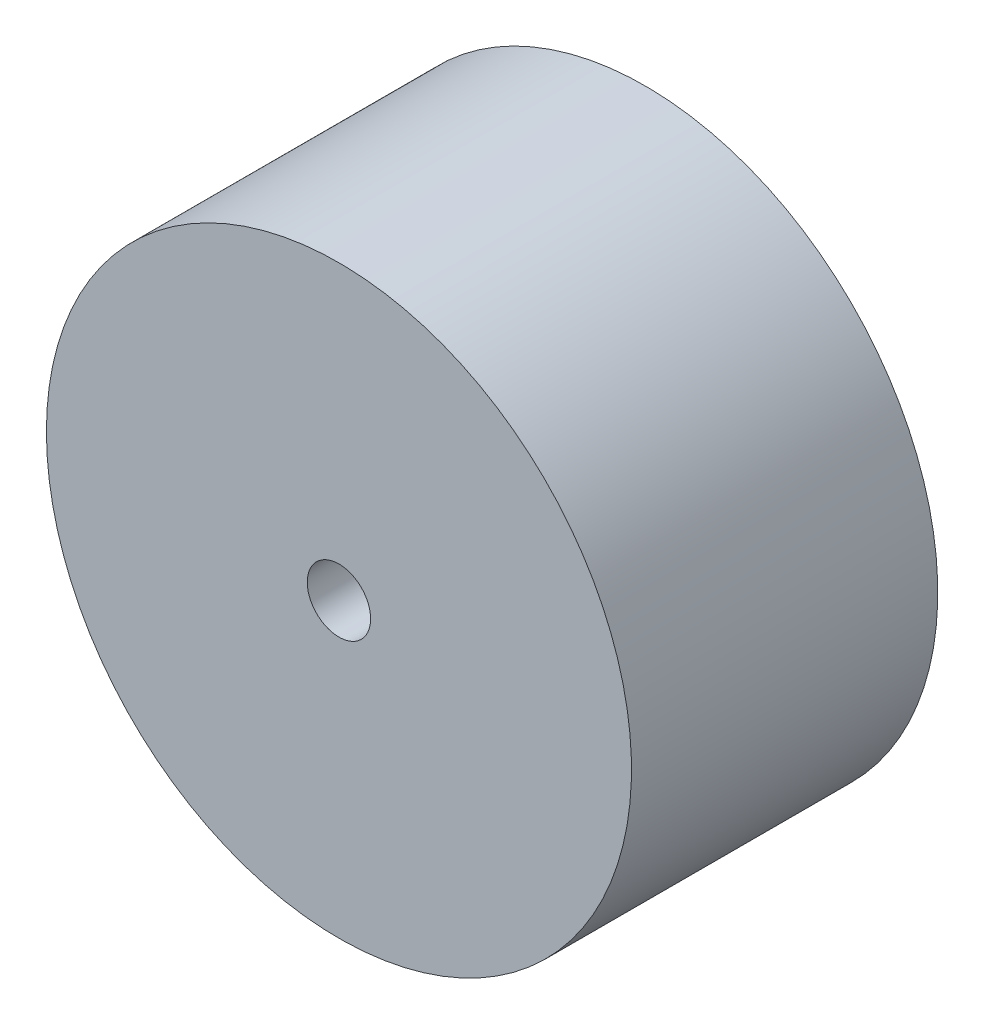
ISO-10303-21;
HEADER;
FILE_DESCRIPTION(('STEP AP214'),'2;1');
FILE_NAME('part.step','',(''),(''),'','','');
FILE_SCHEMA(('AUTOMOTIVE_DESIGN { 1 0 10303 214 1 1 1 1 }'));
ENDSEC;
DATA;
#1=APPLICATION_CONTEXT('core data for automotive mechanical design processes');
#2=APPLICATION_PROTOCOL_DEFINITION('international standard','automotive_design',2000,#1);
#3=PRODUCT_CONTEXT('',#1,'mechanical');
#4=PRODUCT('Part','Part','',(#3));
#5=PRODUCT_RELATED_PRODUCT_CATEGORY('part','',(#4));
#6=PRODUCT_DEFINITION_FORMATION('','',#4);
#7=PRODUCT_DEFINITION_CONTEXT('part definition',#1,'design');
#8=PRODUCT_DEFINITION('design','',#6,#7);
#9=PRODUCT_DEFINITION_SHAPE('','',#8);
#10=(LENGTH_UNIT() NAMED_UNIT(*) SI_UNIT(.MILLI.,.METRE.));
#11=(NAMED_UNIT(*) PLANE_ANGLE_UNIT() SI_UNIT($,.RADIAN.));
#12=(NAMED_UNIT(*) SI_UNIT($,.STERADIAN.) SOLID_ANGLE_UNIT());
#13=UNCERTAINTY_MEASURE_WITH_UNIT(LENGTH_MEASURE(1.E-05),#10,'distance_accuracy_value','');
#14=(GEOMETRIC_REPRESENTATION_CONTEXT(3) GLOBAL_UNCERTAINTY_ASSIGNED_CONTEXT((#13)) GLOBAL_UNIT_ASSIGNED_CONTEXT((#10,
#11,#12)) REPRESENTATION_CONTEXT('',''));
#15=CARTESIAN_POINT('',(0.,0.,0.));
#16=DIRECTION('',(0.,0.,1.));
#17=DIRECTION('',(1.,0.,0.));
#18=AXIS2_PLACEMENT_3D('',#15,#16,#17);
#19=CARTESIAN_POINT('',(0.,0.,14.5));
#20=DIRECTION('',(0.,0.,-1.));
#21=DIRECTION('',(-1.,0.,0.));
#22=AXIS2_PLACEMENT_3D('',#19,#20,#21);
#23=CYLINDRICAL_SURFACE('',#22,13.85);
#24=CARTESIAN_POINT('',(0.,0.,14.5));
#25=DIRECTION('',(0.,0.,1.));
#26=DIRECTION('',(1.,0.,0.));
#27=AXIS2_PLACEMENT_3D('',#24,#25,#26);
#28=CIRCLE('',#27,13.85);
#29=CARTESIAN_POINT('',(-13.85,0.,14.5));
#30=VERTEX_POINT('',#29);
#31=EDGE_CURVE('E10',#30,#30,#28,.T.);
#32=CARTESIAN_POINT('',(0.,0.,0.));
#33=DIRECTION('',(0.,0.,1.));
#34=DIRECTION('',(1.,0.,0.));
#35=AXIS2_PLACEMENT_3D('',#32,#33,#34);
#36=CIRCLE('',#35,13.85);
#37=CARTESIAN_POINT('',(-13.85,0.,0.));
#38=VERTEX_POINT('',#37);
#39=EDGE_CURVE('E41',#38,#38,#36,.T.);
#40=CARTESIAN_POINT('',(-13.85,0.,14.5));
#41=CARTESIAN_POINT('',(-13.85,0.,14.3489583333333));
#42=CARTESIAN_POINT('',(-13.85,0.,14.1979166666667));
#43=CARTESIAN_POINT('',(-13.85,0.,13.8958333333333));
#44=CARTESIAN_POINT('',(-13.85,0.,13.7447916666667));
#45=CARTESIAN_POINT('',(-13.85,0.,13.4427083333333));
#46=CARTESIAN_POINT('',(-13.85,0.,13.2916666666667));
#47=CARTESIAN_POINT('',(-13.85,0.,12.9895833333333));
#48=CARTESIAN_POINT('',(-13.85,0.,12.8385416666667));
#49=CARTESIAN_POINT('',(-13.85,0.,12.5364583333333));
#50=CARTESIAN_POINT('',(-13.85,0.,12.3854166666667));
#51=CARTESIAN_POINT('',(-13.85,0.,12.0833333333333));
#52=CARTESIAN_POINT('',(-13.85,0.,11.9322916666667));
#53=CARTESIAN_POINT('',(-13.85,0.,11.6302083333333));
#54=CARTESIAN_POINT('',(-13.85,0.,11.4791666666667));
#55=CARTESIAN_POINT('',(-13.85,0.,11.1770833333333));
#56=CARTESIAN_POINT('',(-13.85,0.,11.0260416666667));
#57=CARTESIAN_POINT('',(-13.85,0.,10.7239583333333));
#58=CARTESIAN_POINT('',(-13.85,0.,10.5729166666667));
#59=CARTESIAN_POINT('',(-13.85,0.,10.2708333333333));
#60=CARTESIAN_POINT('',(-13.85,0.,10.1197916666667));
#61=CARTESIAN_POINT('',(-13.85,0.,9.81770833333333));
#62=CARTESIAN_POINT('',(-13.85,0.,9.66666666666667));
#63=CARTESIAN_POINT('',(-13.85,0.,9.36458333333333));
#64=CARTESIAN_POINT('',(-13.85,0.,9.21354166666667));
#65=CARTESIAN_POINT('',(-13.85,0.,8.91145833333333));
#66=CARTESIAN_POINT('',(-13.85,0.,8.76041666666667));
#67=CARTESIAN_POINT('',(-13.85,0.,8.45833333333333));
#68=CARTESIAN_POINT('',(-13.85,0.,8.30729166666667));
#69=CARTESIAN_POINT('',(-13.85,0.,8.00520833333333));
#70=CARTESIAN_POINT('',(-13.85,0.,7.85416666666667));
#71=CARTESIAN_POINT('',(-13.85,0.,7.55208333333333));
#72=CARTESIAN_POINT('',(-13.85,0.,7.40104166666667));
#73=CARTESIAN_POINT('',(-13.85,0.,7.09895833333333));
#74=CARTESIAN_POINT('',(-13.85,0.,6.94791666666667));
#75=CARTESIAN_POINT('',(-13.85,0.,6.64583333333333));
#76=CARTESIAN_POINT('',(-13.85,0.,6.49479166666667));
#77=CARTESIAN_POINT('',(-13.85,0.,6.19270833333333));
#78=CARTESIAN_POINT('',(-13.85,0.,6.04166666666667));
#79=CARTESIAN_POINT('',(-13.85,0.,5.73958333333333));
#80=CARTESIAN_POINT('',(-13.85,0.,5.58854166666667));
#81=CARTESIAN_POINT('',(-13.85,0.,5.28645833333333));
#82=CARTESIAN_POINT('',(-13.85,0.,5.13541666666667));
#83=CARTESIAN_POINT('',(-13.85,0.,4.83333333333333));
#84=CARTESIAN_POINT('',(-13.85,0.,4.68229166666667));
#85=CARTESIAN_POINT('',(-13.85,0.,4.38020833333333));
#86=CARTESIAN_POINT('',(-13.85,0.,4.22916666666667));
#87=CARTESIAN_POINT('',(-13.85,0.,3.92708333333333));
#88=CARTESIAN_POINT('',(-13.85,0.,3.77604166666667));
#89=CARTESIAN_POINT('',(-13.85,0.,3.47395833333333));
#90=CARTESIAN_POINT('',(-13.85,0.,3.32291666666667));
#91=CARTESIAN_POINT('',(-13.85,0.,3.02083333333333));
#92=CARTESIAN_POINT('',(-13.85,0.,2.86979166666667));
#93=CARTESIAN_POINT('',(-13.85,0.,2.56770833333333));
#94=CARTESIAN_POINT('',(-13.85,0.,2.41666666666667));
#95=CARTESIAN_POINT('',(-13.85,0.,2.11458333333333));
#96=CARTESIAN_POINT('',(-13.85,0.,1.96354166666667));
#97=CARTESIAN_POINT('',(-13.85,0.,1.66145833333333));
#98=CARTESIAN_POINT('',(-13.85,0.,1.51041666666667));
#99=CARTESIAN_POINT('',(-13.85,0.,1.20833333333333));
#100=CARTESIAN_POINT('',(-13.85,0.,1.05729166666667));
#101=CARTESIAN_POINT('',(-13.85,0.,0.755208333333334));
#102=CARTESIAN_POINT('',(-13.85,0.,0.604166666666667));
#103=CARTESIAN_POINT('',(-13.85,0.,0.302083333333333));
#104=CARTESIAN_POINT('',(-13.85,0.,0.151041666666667));
#105=CARTESIAN_POINT('',(-13.85,0.,0.));
#106=B_SPLINE_CURVE_WITH_KNOTS('',3,(#40,#41,#42,#43,#44,#45,#46,#47,#48,#49,#50,#51,#52,#53,
#54,#55,#56,#57,#58,#59,#60,#61,#62,#63,#64,#65,#66,#67,#68,#69,#70,#71,#72,#73,#74,#75,#76,#77,
#78,#79,#80,#81,#82,#83,#84,#85,#86,#87,#88,#89,#90,#91,#92,#93,#94,#95,#96,#97,#98,#99,#100,
#101,#102,#103,#104,#105),.UNSPECIFIED.,.F.,.F.,(4,2,2,2,2,2,2,2,2,2,2,2,2,2,2,2,2,2,2,2,2,2,2,
2,2,2,2,2,2,2,2,2,4),(0.,0.453124999999999,0.906249999999999,1.359375,1.8125,2.265625,2.71875,
3.171875,3.625,4.078125,4.53125,4.984375,5.4375,5.890625,6.34375,6.796875,7.25,7.703125,8.15625,
8.609375,9.0625,9.515625,9.96875,10.421875,10.875,11.328125,11.78125,12.234375,12.6875,
13.140625,13.59375,14.046875,14.5),.UNSPECIFIED.);
#107=EDGE_CURVE('BSEAM38',#30,#38,#106,.T.);
#108=ORIENTED_EDGE('',*,*,#31,.F.);
#109=ORIENTED_EDGE('',*,*,#39,.T.);
#110=ORIENTED_EDGE('',*,*,#107,.T.);
#111=ORIENTED_EDGE('',*,*,#107,.F.);
#112=EDGE_LOOP('',(#108,#110,#109,#111));
#113=FACE_BOUND('',#112,.T.);
#114=ADVANCED_FACE('F38',(#113),#23,.T.);
#115=CARTESIAN_POINT('',(0.,0.,14.5));
#116=DIRECTION('',(0.,0.,1.));
#117=DIRECTION('',(1.,0.,0.));
#118=AXIS2_PLACEMENT_3D('',#115,#116,#117);
#119=PLANE('',#118);
#120=CARTESIAN_POINT('',(0.,0.,14.5));
#121=DIRECTION('',(0.,0.,-1.));
#122=DIRECTION('',(-1.,0.,0.));
#123=AXIS2_PLACEMENT_3D('',#120,#121,#122);
#124=CIRCLE('',#123,1.5);
#125=CARTESIAN_POINT('',(-1.5,0.,14.5));
#126=VERTEX_POINT('',#125);
#127=EDGE_CURVE('E48',#126,#126,#124,.T.);
#128=ORIENTED_EDGE('',*,*,#127,.T.);
#129=EDGE_LOOP('',(#128));
#130=FACE_BOUND('',#129,.T.);
#131=ORIENTED_EDGE('',*,*,#31,.T.);
#132=EDGE_LOOP('',(#131));
#133=FACE_BOUND('',#132,.T.);
#134=ADVANCED_FACE('F56',(#130,#133),#119,.T.);
#135=CARTESIAN_POINT('',(0.,0.,0.));
#136=DIRECTION('',(0.,0.,1.));
#137=DIRECTION('',(1.,0.,0.));
#138=AXIS2_PLACEMENT_3D('',#135,#136,#137);
#139=PLANE('',#138);
#140=CARTESIAN_POINT('',(0.,0.,0.));
#141=DIRECTION('',(0.,0.,-1.));
#142=DIRECTION('',(-1.,0.,0.));
#143=AXIS2_PLACEMENT_3D('',#140,#141,#142);
#144=CIRCLE('',#143,1.5);
#145=CARTESIAN_POINT('',(-1.5,0.,0.));
#146=VERTEX_POINT('',#145);
#147=EDGE_CURVE('E50',#146,#146,#144,.T.);
#148=ORIENTED_EDGE('',*,*,#147,.F.);
#149=EDGE_LOOP('',(#148));
#150=FACE_BOUND('',#149,.T.);
#151=ORIENTED_EDGE('',*,*,#39,.F.);
#152=EDGE_LOOP('',(#151));
#153=FACE_BOUND('',#152,.T.);
#154=ADVANCED_FACE('F61',(#150,#153),#139,.F.);
#155=CARTESIAN_POINT('',(0.,0.,14.5));
#156=DIRECTION('',(0.,0.,-1.));
#157=DIRECTION('',(-1.,0.,0.));
#158=AXIS2_PLACEMENT_3D('',#155,#156,#157);
#159=CYLINDRICAL_SURFACE('',#158,1.5);
#160=CARTESIAN_POINT('',(-1.5,0.,14.5));
#161=CARTESIAN_POINT('',(-1.5,0.,14.3489583333333));
#162=CARTESIAN_POINT('',(-1.5,0.,14.1979166666667));
#163=CARTESIAN_POINT('',(-1.5,0.,13.8958333333333));
#164=CARTESIAN_POINT('',(-1.5,0.,13.7447916666667));
#165=CARTESIAN_POINT('',(-1.5,0.,13.4427083333333));
#166=CARTESIAN_POINT('',(-1.5,0.,13.2916666666667));
#167=CARTESIAN_POINT('',(-1.5,0.,12.9895833333333));
#168=CARTESIAN_POINT('',(-1.5,0.,12.8385416666667));
#169=CARTESIAN_POINT('',(-1.5,0.,12.5364583333333));
#170=CARTESIAN_POINT('',(-1.5,0.,12.3854166666667));
#171=CARTESIAN_POINT('',(-1.5,0.,12.0833333333333));
#172=CARTESIAN_POINT('',(-1.5,0.,11.9322916666667));
#173=CARTESIAN_POINT('',(-1.5,0.,11.6302083333333));
#174=CARTESIAN_POINT('',(-1.5,0.,11.4791666666667));
#175=CARTESIAN_POINT('',(-1.5,0.,11.1770833333333));
#176=CARTESIAN_POINT('',(-1.5,0.,11.0260416666667));
#177=CARTESIAN_POINT('',(-1.5,0.,10.7239583333333));
#178=CARTESIAN_POINT('',(-1.5,0.,10.5729166666667));
#179=CARTESIAN_POINT('',(-1.5,0.,10.2708333333333));
#180=CARTESIAN_POINT('',(-1.5,0.,10.1197916666667));
#181=CARTESIAN_POINT('',(-1.5,0.,9.81770833333333));
#182=CARTESIAN_POINT('',(-1.5,0.,9.66666666666667));
#183=CARTESIAN_POINT('',(-1.5,0.,9.36458333333333));
#184=CARTESIAN_POINT('',(-1.5,0.,9.21354166666667));
#185=CARTESIAN_POINT('',(-1.5,0.,8.91145833333333));
#186=CARTESIAN_POINT('',(-1.5,0.,8.76041666666667));
#187=CARTESIAN_POINT('',(-1.5,0.,8.45833333333333));
#188=CARTESIAN_POINT('',(-1.5,0.,8.30729166666667));
#189=CARTESIAN_POINT('',(-1.5,0.,8.00520833333333));
#190=CARTESIAN_POINT('',(-1.5,0.,7.85416666666667));
#191=CARTESIAN_POINT('',(-1.5,0.,7.55208333333333));
#192=CARTESIAN_POINT('',(-1.5,0.,7.40104166666667));
#193=CARTESIAN_POINT('',(-1.5,0.,7.09895833333333));
#194=CARTESIAN_POINT('',(-1.5,0.,6.94791666666667));
#195=CARTESIAN_POINT('',(-1.5,0.,6.64583333333333));
#196=CARTESIAN_POINT('',(-1.5,0.,6.49479166666667));
#197=CARTESIAN_POINT('',(-1.5,0.,6.19270833333334));
#198=CARTESIAN_POINT('',(-1.5,0.,6.04166666666667));
#199=CARTESIAN_POINT('',(-1.5,0.,5.73958333333333));
#200=CARTESIAN_POINT('',(-1.5,0.,5.58854166666667));
#201=CARTESIAN_POINT('',(-1.5,0.,5.28645833333333));
#202=CARTESIAN_POINT('',(-1.5,0.,5.13541666666667));
#203=CARTESIAN_POINT('',(-1.5,0.,4.83333333333333));
#204=CARTESIAN_POINT('',(-1.5,0.,4.68229166666667));
#205=CARTESIAN_POINT('',(-1.5,0.,4.38020833333333));
#206=CARTESIAN_POINT('',(-1.5,0.,4.22916666666667));
#207=CARTESIAN_POINT('',(-1.5,0.,3.92708333333334));
#208=CARTESIAN_POINT('',(-1.5,0.,3.77604166666667));
#209=CARTESIAN_POINT('',(-1.5,0.,3.47395833333333));
#210=CARTESIAN_POINT('',(-1.5,0.,3.32291666666667));
#211=CARTESIAN_POINT('',(-1.5,0.,3.02083333333333));
#212=CARTESIAN_POINT('',(-1.5,0.,2.86979166666667));
#213=CARTESIAN_POINT('',(-1.5,0.,2.56770833333333));
#214=CARTESIAN_POINT('',(-1.5,0.,2.41666666666667));
#215=CARTESIAN_POINT('',(-1.5,0.,2.11458333333333));
#216=CARTESIAN_POINT('',(-1.5,0.,1.96354166666667));
#217=CARTESIAN_POINT('',(-1.5,0.,1.66145833333333));
#218=CARTESIAN_POINT('',(-1.5,0.,1.51041666666667));
#219=CARTESIAN_POINT('',(-1.5,0.,1.20833333333333));
#220=CARTESIAN_POINT('',(-1.5,0.,1.05729166666667));
#221=CARTESIAN_POINT('',(-1.5,0.,0.755208333333334));
#222=CARTESIAN_POINT('',(-1.5,0.,0.604166666666667));
#223=CARTESIAN_POINT('',(-1.5,0.,0.302083333333334));
#224=CARTESIAN_POINT('',(-1.5,0.,0.151041666666667));
#225=CARTESIAN_POINT('',(-1.5,0.,0.));
#226=B_SPLINE_CURVE_WITH_KNOTS('',3,(#160,#161,#162,#163,#164,#165,#166,#167,#168,#169,#170,
#171,#172,#173,#174,#175,#176,#177,#178,#179,#180,#181,#182,#183,#184,#185,#186,#187,#188,#189,
#190,#191,#192,#193,#194,#195,#196,#197,#198,#199,#200,#201,#202,#203,#204,#205,#206,#207,#208,
#209,#210,#211,#212,#213,#214,#215,#216,#217,#218,#219,#220,#221,#222,#223,#224,#225),
.UNSPECIFIED.,.F.,.F.,(4,2,2,2,2,2,2,2,2,2,2,2,2,2,2,2,2,2,2,2,2,2,2,2,2,2,2,2,2,2,2,2,4),(0.,
0.453125,0.906250000000001,1.359375,1.8125,2.265625,2.71875,3.171875,3.625,4.078125,4.53125,
4.984375,5.4375,5.890625,6.34375,6.796875,7.25,7.703125,8.15625,8.609375,9.0625,9.515625,
9.96875,10.421875,10.875,11.328125,11.78125,12.234375,12.6875,13.140625,13.59375,14.046875,
14.5),.UNSPECIFIED.);
#227=EDGE_CURVE('BSEAM58',#126,#146,#226,.T.);
#228=ORIENTED_EDGE('',*,*,#127,.F.);
#229=ORIENTED_EDGE('',*,*,#147,.T.);
#230=ORIENTED_EDGE('',*,*,#227,.T.);
#231=ORIENTED_EDGE('',*,*,#227,.F.);
#232=EDGE_LOOP('',(#228,#230,#229,#231));
#233=FACE_BOUND('',#232,.T.);
#234=ADVANCED_FACE('F58',(#233),#159,.F.);
#235=CLOSED_SHELL('',(#114,#134,#154,#234));
#236=MANIFOLD_SOLID_BREP('B2',#235);
#237=ADVANCED_BREP_SHAPE_REPRESENTATION('',(#18,#236),#14);
#238=SHAPE_DEFINITION_REPRESENTATION(#9,#237);
ENDSEC;
END-ISO-10303-21;
